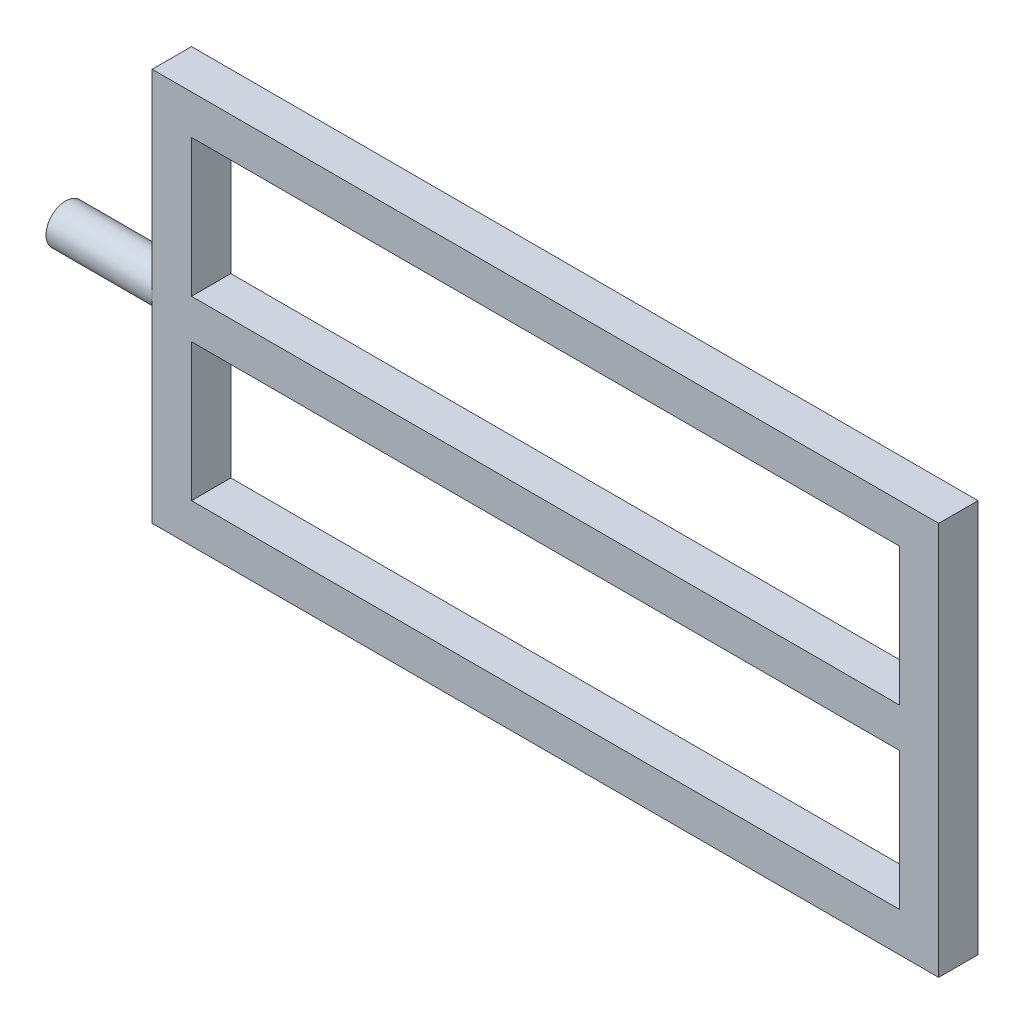
ISO-10303-21;
HEADER;
FILE_DESCRIPTION(('STEP AP214'),'2;1');
FILE_NAME('part.step','',(''),(''),'','','');
FILE_SCHEMA(('AUTOMOTIVE_DESIGN { 1 0 10303 214 1 1 1 1 }'));
ENDSEC;
DATA;
#1=APPLICATION_CONTEXT('core data for automotive mechanical design processes');
#2=APPLICATION_PROTOCOL_DEFINITION('international standard','automotive_design',2000,#1);
#3=PRODUCT_CONTEXT('',#1,'mechanical');
#4=PRODUCT('Part','Part','',(#3));
#5=PRODUCT_RELATED_PRODUCT_CATEGORY('part','',(#4));
#6=PRODUCT_DEFINITION_FORMATION('','',#4);
#7=PRODUCT_DEFINITION_CONTEXT('part definition',#1,'design');
#8=PRODUCT_DEFINITION('design','',#6,#7);
#9=PRODUCT_DEFINITION_SHAPE('','',#8);
#10=(LENGTH_UNIT() NAMED_UNIT(*) SI_UNIT(.MILLI.,.METRE.));
#11=(NAMED_UNIT(*) PLANE_ANGLE_UNIT() SI_UNIT($,.RADIAN.));
#12=(NAMED_UNIT(*) SI_UNIT($,.STERADIAN.) SOLID_ANGLE_UNIT());
#13=UNCERTAINTY_MEASURE_WITH_UNIT(LENGTH_MEASURE(1.E-05),#10,'distance_accuracy_value','');
#14=(GEOMETRIC_REPRESENTATION_CONTEXT(3) GLOBAL_UNCERTAINTY_ASSIGNED_CONTEXT((#13)) GLOBAL_UNIT_ASSIGNED_CONTEXT((#10,
#11,#12)) REPRESENTATION_CONTEXT('',''));
#15=CARTESIAN_POINT('',(0.,0.,0.));
#16=DIRECTION('',(0.,0.,1.));
#17=DIRECTION('',(1.,0.,0.));
#18=AXIS2_PLACEMENT_3D('',#15,#16,#17);
#19=CARTESIAN_POINT('',(-508.547008547008,495.726479063157,0.));
#20=DIRECTION('',(-1.,0.,0.));
#21=DIRECTION('',(0.,-1.,0.));
#22=AXIS2_PLACEMENT_3D('',#19,#20,#21);
#23=PLANE('',#22);
#24=CARTESIAN_POINT('',(-508.547008547008,245.726479063157,25.));
#25=DIRECTION('',(-1.,0.,0.));
#26=DIRECTION('',(0.,0.,1.));
#27=AXIS2_PLACEMENT_3D('',#24,#25,#26);
#28=CIRCLE('',#27,25.);
#29=CARTESIAN_POINT('',(-508.547008547008,245.726479063157,50.));
#30=VERTEX_POINT('',#29);
#31=CARTESIAN_POINT('',(-508.547008547008,245.726479063157,0.));
#32=VERTEX_POINT('',#31);
#33=EDGE_CURVE('E47',#30,#32,#28,.T.);
#34=ORIENTED_EDGE('',*,*,#33,.F.);
#35=DIRECTION('',(0.,-1.,0.));
#36=VECTOR('',#35,1.);
#37=CARTESIAN_POINT('',(-508.547008547008,495.726479063157,50.));
#38=LINE('',#37,#36);
#39=CARTESIAN_POINT('',(-508.547008547008,495.726479063157,50.));
#40=VERTEX_POINT('',#39);
#41=EDGE_CURVE('E141',#40,#30,#38,.T.);
#42=ORIENTED_EDGE('',*,*,#41,.F.);
#43=DIRECTION('',(0.,0.,1.));
#44=VECTOR('',#43,1.);
#45=CARTESIAN_POINT('',(-508.547008547008,495.726479063157,0.));
#46=LINE('',#45,#44);
#47=CARTESIAN_POINT('',(-508.547008547008,495.726479063157,0.));
#48=VERTEX_POINT('',#47);
#49=EDGE_CURVE('E208',#48,#40,#46,.T.);
#50=ORIENTED_EDGE('',*,*,#49,.F.);
#51=DIRECTION('',(0.,-1.,0.));
#52=VECTOR('',#51,1.);
#53=CARTESIAN_POINT('',(-508.547008547008,495.726479063157,0.));
#54=LINE('',#53,#52);
#55=EDGE_CURVE('E262',#48,#32,#54,.T.);
#56=ORIENTED_EDGE('',*,*,#55,.T.);
#57=EDGE_LOOP('',(#34,#42,#50,#56));
#58=FACE_BOUND('',#57,.T.);
#59=ADVANCED_FACE('F36',(#58),#23,.T.);
#60=CARTESIAN_POINT('',(-8.54700854700846,245.726479063157,0.));
#61=DIRECTION('',(0.,0.,1.));
#62=DIRECTION('',(1.,0.,0.));
#63=AXIS2_PLACEMENT_3D('',#60,#61,#62);
#64=PLANE('',#63);
#65=DIRECTION('',(0.,1.,0.));
#66=VECTOR('',#65,1.);
#67=CARTESIAN_POINT('',(-458.547008547008,45.7264790631568,0.));
#68=LINE('',#67,#66);
#69=CARTESIAN_POINT('',(-458.547008547008,45.7264790631568,0.));
#70=VERTEX_POINT('',#69);
#71=CARTESIAN_POINT('',(-458.547008547009,220.726479063157,0.));
#72=VERTEX_POINT('',#71);
#73=EDGE_CURVE('E190',#70,#72,#68,.T.);
#74=ORIENTED_EDGE('',*,*,#73,.F.);
#75=DIRECTION('',(-1.,0.,0.));
#76=VECTOR('',#75,1.);
#77=CARTESIAN_POINT('',(441.452991452991,45.726479063157,0.));
#78=LINE('',#77,#76);
#79=CARTESIAN_POINT('',(441.452991452991,45.726479063157,0.));
#80=VERTEX_POINT('',#79);
#81=EDGE_CURVE('E227',#80,#70,#78,.T.);
#82=ORIENTED_EDGE('',*,*,#81,.F.);
#83=DIRECTION('',(0.,-1.,0.));
#84=VECTOR('',#83,1.);
#85=CARTESIAN_POINT('',(441.452991452991,220.726479063157,0.));
#86=LINE('',#85,#84);
#87=CARTESIAN_POINT('',(441.452991452991,220.726479063157,0.));
#88=VERTEX_POINT('',#87);
#89=EDGE_CURVE('E135',#88,#80,#86,.T.);
#90=ORIENTED_EDGE('',*,*,#89,.F.);
#91=DIRECTION('',(1.,0.,0.));
#92=VECTOR('',#91,1.);
#93=CARTESIAN_POINT('',(-458.547008547009,220.726479063157,0.));
#94=LINE('',#93,#92);
#95=EDGE_CURVE('E204',#72,#88,#94,.T.);
#96=ORIENTED_EDGE('',*,*,#95,.F.);
#97=EDGE_LOOP('',(#74,#82,#90,#96));
#98=FACE_BOUND('',#97,.T.);
#99=DIRECTION('',(-1.,0.,0.));
#100=VECTOR('',#99,1.);
#101=CARTESIAN_POINT('',(441.452991452991,270.726479063157,0.));
#102=LINE('',#101,#100);
#103=CARTESIAN_POINT('',(441.452991452991,270.726479063157,0.));
#104=VERTEX_POINT('',#103);
#105=CARTESIAN_POINT('',(-458.547008547009,270.726479063156,0.));
#106=VERTEX_POINT('',#105);
#107=EDGE_CURVE('E159',#104,#106,#102,.T.);
#108=ORIENTED_EDGE('',*,*,#107,.F.);
#109=DIRECTION('',(0.,-1.,0.));
#110=VECTOR('',#109,1.);
#111=CARTESIAN_POINT('',(441.452991452991,445.726479063157,0.));
#112=LINE('',#111,#110);
#113=CARTESIAN_POINT('',(441.452991452991,445.726479063157,0.));
#114=VERTEX_POINT('',#113);
#115=EDGE_CURVE('E174',#114,#104,#112,.T.);
#116=ORIENTED_EDGE('',*,*,#115,.F.);
#117=DIRECTION('',(1.,0.,0.));
#118=VECTOR('',#117,1.);
#119=CARTESIAN_POINT('',(-458.547008547009,445.726479063156,0.));
#120=LINE('',#119,#118);
#121=CARTESIAN_POINT('',(-458.547008547009,445.726479063156,0.));
#122=VERTEX_POINT('',#121);
#123=EDGE_CURVE('E198',#122,#114,#120,.T.);
#124=ORIENTED_EDGE('',*,*,#123,.F.);
#125=DIRECTION('',(0.,1.,0.));
#126=VECTOR('',#125,1.);
#127=CARTESIAN_POINT('',(-458.547008547009,270.726479063156,0.));
#128=LINE('',#127,#126);
#129=EDGE_CURVE('E224',#106,#122,#128,.T.);
#130=ORIENTED_EDGE('',*,*,#129,.F.);
#131=EDGE_LOOP('',(#108,#116,#124,#130));
#132=FACE_BOUND('',#131,.T.);
#133=DIRECTION('',(1.,0.,0.));
#134=VECTOR('',#133,1.);
#135=CARTESIAN_POINT('',(-508.547008547008,-4.27352093684319,0.));
#136=LINE('',#135,#134);
#137=CARTESIAN_POINT('',(-508.547008547008,-4.27352093684319,0.));
#138=VERTEX_POINT('',#137);
#139=CARTESIAN_POINT('',(491.452991452992,-4.27352093684308,0.));
#140=VERTEX_POINT('',#139);
#141=EDGE_CURVE('E232',#138,#140,#136,.T.);
#142=ORIENTED_EDGE('',*,*,#141,.F.);
#143=EDGE_CURVE('E99',#32,#138,#54,.T.);
#144=ORIENTED_EDGE('',*,*,#143,.F.);
#145=ORIENTED_EDGE('',*,*,#55,.F.);
#146=DIRECTION('',(-1.,0.,0.));
#147=VECTOR('',#146,1.);
#148=CARTESIAN_POINT('',(491.452991452992,495.726479063157,0.));
#149=LINE('',#148,#147);
#150=CARTESIAN_POINT('',(491.452991452992,495.726479063157,0.));
#151=VERTEX_POINT('',#150);
#152=EDGE_CURVE('E107',#151,#48,#149,.T.);
#153=ORIENTED_EDGE('',*,*,#152,.F.);
#154=DIRECTION('',(0.,1.,0.));
#155=VECTOR('',#154,1.);
#156=CARTESIAN_POINT('',(491.452991452992,-4.27352093684308,0.));
#157=LINE('',#156,#155);
#158=EDGE_CURVE('E182',#140,#151,#157,.T.);
#159=ORIENTED_EDGE('',*,*,#158,.F.);
#160=EDGE_LOOP('',(#142,#144,#145,#153,#159));
#161=FACE_BOUND('',#160,.T.);
#162=ADVANCED_FACE('F284',(#98,#132,#161),#64,.F.);
#163=CARTESIAN_POINT('',(-8.54700854700846,245.726479063157,50.));
#164=DIRECTION('',(0.,0.,1.));
#165=DIRECTION('',(1.,0.,0.));
#166=AXIS2_PLACEMENT_3D('',#163,#164,#165);
#167=PLANE('',#166);
#168=DIRECTION('',(0.,1.,0.));
#169=VECTOR('',#168,1.);
#170=CARTESIAN_POINT('',(-458.547008547008,45.7264790631568,50.));
#171=LINE('',#170,#169);
#172=CARTESIAN_POINT('',(-458.547008547008,45.7264790631568,50.));
#173=VERTEX_POINT('',#172);
#174=CARTESIAN_POINT('',(-458.547008547009,220.726479063157,50.));
#175=VERTEX_POINT('',#174);
#176=EDGE_CURVE('E177',#173,#175,#171,.T.);
#177=ORIENTED_EDGE('',*,*,#176,.T.);
#178=DIRECTION('',(1.,0.,0.));
#179=VECTOR('',#178,1.);
#180=CARTESIAN_POINT('',(-458.547008547009,220.726479063157,50.));
#181=LINE('',#180,#179);
#182=CARTESIAN_POINT('',(441.452991452991,220.726479063157,50.));
#183=VERTEX_POINT('',#182);
#184=EDGE_CURVE('E191',#175,#183,#181,.T.);
#185=ORIENTED_EDGE('',*,*,#184,.T.);
#186=DIRECTION('',(0.,-1.,0.));
#187=VECTOR('',#186,1.);
#188=CARTESIAN_POINT('',(441.452991452991,220.726479063157,50.));
#189=LINE('',#188,#187);
#190=CARTESIAN_POINT('',(441.452991452991,45.7264790631569,50.));
#191=VERTEX_POINT('',#190);
#192=EDGE_CURVE('E241',#183,#191,#189,.T.);
#193=ORIENTED_EDGE('',*,*,#192,.T.);
#194=DIRECTION('',(-1.,0.,0.));
#195=VECTOR('',#194,1.);
#196=CARTESIAN_POINT('',(441.452991452991,45.7264790631569,50.));
#197=LINE('',#196,#195);
#198=EDGE_CURVE('E211',#191,#173,#197,.T.);
#199=ORIENTED_EDGE('',*,*,#198,.T.);
#200=EDGE_LOOP('',(#177,#185,#193,#199));
#201=FACE_BOUND('',#200,.T.);
#202=DIRECTION('',(-1.,0.,0.));
#203=VECTOR('',#202,1.);
#204=CARTESIAN_POINT('',(441.452991452991,270.726479063157,50.));
#205=LINE('',#204,#203);
#206=CARTESIAN_POINT('',(441.452991452991,270.726479063157,50.));
#207=VERTEX_POINT('',#206);
#208=CARTESIAN_POINT('',(-458.547008547009,270.726479063156,50.));
#209=VERTEX_POINT('',#208);
#210=EDGE_CURVE('E148',#207,#209,#205,.T.);
#211=ORIENTED_EDGE('',*,*,#210,.T.);
#212=DIRECTION('',(0.,1.,0.));
#213=VECTOR('',#212,1.);
#214=CARTESIAN_POINT('',(-458.547008547009,270.726479063156,50.));
#215=LINE('',#214,#213);
#216=CARTESIAN_POINT('',(-458.547008547009,445.726479063156,50.));
#217=VERTEX_POINT('',#216);
#218=EDGE_CURVE('E203',#209,#217,#215,.T.);
#219=ORIENTED_EDGE('',*,*,#218,.T.);
#220=DIRECTION('',(1.,0.,0.));
#221=VECTOR('',#220,1.);
#222=CARTESIAN_POINT('',(-458.547008547009,445.726479063156,50.));
#223=LINE('',#222,#221);
#224=CARTESIAN_POINT('',(441.452991452991,445.726479063156,50.));
#225=VERTEX_POINT('',#224);
#226=EDGE_CURVE('E165',#217,#225,#223,.T.);
#227=ORIENTED_EDGE('',*,*,#226,.T.);
#228=DIRECTION('',(0.,-1.,0.));
#229=VECTOR('',#228,1.);
#230=CARTESIAN_POINT('',(441.452991452991,445.726479063156,50.));
#231=LINE('',#230,#229);
#232=EDGE_CURVE('E162',#225,#207,#231,.T.);
#233=ORIENTED_EDGE('',*,*,#232,.T.);
#234=EDGE_LOOP('',(#211,#219,#227,#233));
#235=FACE_BOUND('',#234,.T.);
#236=DIRECTION('',(1.,0.,0.));
#237=VECTOR('',#236,1.);
#238=CARTESIAN_POINT('',(-508.547008547008,-4.2735209368433,50.));
#239=LINE('',#238,#237);
#240=CARTESIAN_POINT('',(-508.547008547008,-4.2735209368433,50.));
#241=VERTEX_POINT('',#240);
#242=CARTESIAN_POINT('',(491.452991452992,-4.27352093684308,50.));
#243=VERTEX_POINT('',#242);
#244=EDGE_CURVE('E45',#241,#243,#239,.T.);
#245=ORIENTED_EDGE('',*,*,#244,.T.);
#246=DIRECTION('',(0.,1.,0.));
#247=VECTOR('',#246,1.);
#248=CARTESIAN_POINT('',(491.452991452992,-4.27352093684308,50.));
#249=LINE('',#248,#247);
#250=CARTESIAN_POINT('',(491.452991452992,495.726479063157,50.));
#251=VERTEX_POINT('',#250);
#252=EDGE_CURVE('E185',#243,#251,#249,.T.);
#253=ORIENTED_EDGE('',*,*,#252,.T.);
#254=DIRECTION('',(-1.,0.,0.));
#255=VECTOR('',#254,1.);
#256=CARTESIAN_POINT('',(491.452991452992,495.726479063157,50.));
#257=LINE('',#256,#255);
#258=EDGE_CURVE('E197',#251,#40,#257,.T.);
#259=ORIENTED_EDGE('',*,*,#258,.T.);
#260=ORIENTED_EDGE('',*,*,#41,.T.);
#261=EDGE_CURVE('E240',#30,#241,#38,.T.);
#262=ORIENTED_EDGE('',*,*,#261,.T.);
#263=EDGE_LOOP('',(#245,#253,#259,#260,#262));
#264=FACE_BOUND('',#263,.T.);
#265=ADVANCED_FACE('F163',(#201,#235,#264),#167,.T.);
#266=CARTESIAN_POINT('',(-508.547008547008,-4.27352093684319,0.));
#267=DIRECTION('',(0.,-1.,0.));
#268=DIRECTION('',(1.,0.,0.));
#269=AXIS2_PLACEMENT_3D('',#266,#267,#268);
#270=PLANE('',#269);
#271=ORIENTED_EDGE('',*,*,#141,.T.);
#272=DIRECTION('',(0.,0.,1.));
#273=VECTOR('',#272,1.);
#274=CARTESIAN_POINT('',(491.452991452992,-4.27352093684308,0.));
#275=LINE('',#274,#273);
#276=EDGE_CURVE('E181',#140,#243,#275,.T.);
#277=ORIENTED_EDGE('',*,*,#276,.T.);
#278=ORIENTED_EDGE('',*,*,#244,.F.);
#279=DIRECTION('',(0.,0.,1.));
#280=VECTOR('',#279,1.);
#281=CARTESIAN_POINT('',(-508.547008547008,-4.27352093684319,0.));
#282=LINE('',#281,#280);
#283=EDGE_CURVE('E40',#138,#241,#282,.T.);
#284=ORIENTED_EDGE('',*,*,#283,.F.);
#285=EDGE_LOOP('',(#271,#277,#278,#284));
#286=FACE_BOUND('',#285,.T.);
#287=ADVANCED_FACE('F308',(#286),#270,.T.);
#288=CARTESIAN_POINT('',(491.452991452992,-4.27352093684308,0.));
#289=DIRECTION('',(1.,0.,0.));
#290=DIRECTION('',(0.,1.,0.));
#291=AXIS2_PLACEMENT_3D('',#288,#289,#290);
#292=PLANE('',#291);
#293=ORIENTED_EDGE('',*,*,#158,.T.);
#294=DIRECTION('',(0.,0.,1.));
#295=VECTOR('',#294,1.);
#296=CARTESIAN_POINT('',(491.452991452992,495.726479063157,0.));
#297=LINE('',#296,#295);
#298=EDGE_CURVE('E186',#151,#251,#297,.T.);
#299=ORIENTED_EDGE('',*,*,#298,.T.);
#300=ORIENTED_EDGE('',*,*,#252,.F.);
#301=ORIENTED_EDGE('',*,*,#276,.F.);
#302=EDGE_LOOP('',(#293,#299,#300,#301));
#303=FACE_BOUND('',#302,.T.);
#304=ADVANCED_FACE('F320',(#303),#292,.T.);
#305=CARTESIAN_POINT('',(491.452991452992,495.726479063157,0.));
#306=DIRECTION('',(0.,1.,0.));
#307=DIRECTION('',(-1.,0.,0.));
#308=AXIS2_PLACEMENT_3D('',#305,#306,#307);
#309=PLANE('',#308);
#310=ORIENTED_EDGE('',*,*,#152,.T.);
#311=ORIENTED_EDGE('',*,*,#49,.T.);
#312=ORIENTED_EDGE('',*,*,#258,.F.);
#313=ORIENTED_EDGE('',*,*,#298,.F.);
#314=EDGE_LOOP('',(#310,#311,#312,#313));
#315=FACE_BOUND('',#314,.T.);
#316=ADVANCED_FACE('F332',(#315),#309,.T.);
#317=EDGE_CURVE('E11',#32,#30,#28,.T.);
#318=ORIENTED_EDGE('',*,*,#317,.F.);
#319=ORIENTED_EDGE('',*,*,#143,.T.);
#320=ORIENTED_EDGE('',*,*,#283,.T.);
#321=ORIENTED_EDGE('',*,*,#261,.F.);
#322=EDGE_LOOP('',(#318,#319,#320,#321));
#323=FACE_BOUND('',#322,.T.);
#324=ADVANCED_FACE('F286',(#323),#23,.T.);
#325=CARTESIAN_POINT('',(441.452991452991,270.726479063157,0.));
#326=DIRECTION('',(0.,1.,0.));
#327=DIRECTION('',(-1.,0.,0.));
#328=AXIS2_PLACEMENT_3D('',#325,#326,#327);
#329=PLANE('',#328);
#330=ORIENTED_EDGE('',*,*,#107,.T.);
#331=DIRECTION('',(0.,0.,1.));
#332=VECTOR('',#331,1.);
#333=CARTESIAN_POINT('',(-458.547008547009,270.726479063156,0.));
#334=LINE('',#333,#332);
#335=EDGE_CURVE('E155',#106,#209,#334,.T.);
#336=ORIENTED_EDGE('',*,*,#335,.T.);
#337=ORIENTED_EDGE('',*,*,#210,.F.);
#338=DIRECTION('',(0.,0.,1.));
#339=VECTOR('',#338,1.);
#340=CARTESIAN_POINT('',(441.452991452991,270.726479063157,0.));
#341=LINE('',#340,#339);
#342=EDGE_CURVE('E152',#104,#207,#341,.T.);
#343=ORIENTED_EDGE('',*,*,#342,.F.);
#344=EDGE_LOOP('',(#330,#336,#337,#343));
#345=FACE_BOUND('',#344,.T.);
#346=ADVANCED_FACE('F150',(#345),#329,.T.);
#347=CARTESIAN_POINT('',(-458.547008547009,270.726479063156,0.));
#348=DIRECTION('',(1.,0.,0.));
#349=DIRECTION('',(0.,1.,0.));
#350=AXIS2_PLACEMENT_3D('',#347,#348,#349);
#351=PLANE('',#350);
#352=ORIENTED_EDGE('',*,*,#129,.T.);
#353=DIRECTION('',(0.,0.,1.));
#354=VECTOR('',#353,1.);
#355=CARTESIAN_POINT('',(-458.547008547009,445.726479063156,0.));
#356=LINE('',#355,#354);
#357=EDGE_CURVE('E237',#122,#217,#356,.T.);
#358=ORIENTED_EDGE('',*,*,#357,.T.);
#359=ORIENTED_EDGE('',*,*,#218,.F.);
#360=ORIENTED_EDGE('',*,*,#335,.F.);
#361=EDGE_LOOP('',(#352,#358,#359,#360));
#362=FACE_BOUND('',#361,.T.);
#363=ADVANCED_FACE('F360',(#362),#351,.T.);
#364=CARTESIAN_POINT('',(-458.547008547009,445.726479063156,0.));
#365=DIRECTION('',(0.,-1.,0.));
#366=DIRECTION('',(1.,0.,0.));
#367=AXIS2_PLACEMENT_3D('',#364,#365,#366);
#368=PLANE('',#367);
#369=ORIENTED_EDGE('',*,*,#123,.T.);
#370=DIRECTION('',(0.,0.,1.));
#371=VECTOR('',#370,1.);
#372=CARTESIAN_POINT('',(441.452991452991,445.726479063157,0.));
#373=LINE('',#372,#371);
#374=EDGE_CURVE('E170',#114,#225,#373,.T.);
#375=ORIENTED_EDGE('',*,*,#374,.T.);
#376=ORIENTED_EDGE('',*,*,#226,.F.);
#377=ORIENTED_EDGE('',*,*,#357,.F.);
#378=EDGE_LOOP('',(#369,#375,#376,#377));
#379=FACE_BOUND('',#378,.T.);
#380=ADVANCED_FACE('F368',(#379),#368,.T.);
#381=CARTESIAN_POINT('',(441.452991452991,445.726479063157,0.));
#382=DIRECTION('',(-1.,0.,0.));
#383=DIRECTION('',(0.,-1.,0.));
#384=AXIS2_PLACEMENT_3D('',#381,#382,#383);
#385=PLANE('',#384);
#386=ORIENTED_EDGE('',*,*,#115,.T.);
#387=ORIENTED_EDGE('',*,*,#342,.T.);
#388=ORIENTED_EDGE('',*,*,#232,.F.);
#389=ORIENTED_EDGE('',*,*,#374,.F.);
#390=EDGE_LOOP('',(#386,#387,#388,#389));
#391=FACE_BOUND('',#390,.T.);
#392=ADVANCED_FACE('F172',(#391),#385,.T.);
#393=CARTESIAN_POINT('',(-458.547008547008,45.7264790631568,0.));
#394=DIRECTION('',(1.,0.,0.));
#395=DIRECTION('',(0.,1.,0.));
#396=AXIS2_PLACEMENT_3D('',#393,#394,#395);
#397=PLANE('',#396);
#398=ORIENTED_EDGE('',*,*,#73,.T.);
#399=DIRECTION('',(0.,0.,1.));
#400=VECTOR('',#399,1.);
#401=CARTESIAN_POINT('',(-458.547008547009,220.726479063157,0.));
#402=LINE('',#401,#400);
#403=EDGE_CURVE('E187',#72,#175,#402,.T.);
#404=ORIENTED_EDGE('',*,*,#403,.T.);
#405=ORIENTED_EDGE('',*,*,#176,.F.);
#406=DIRECTION('',(0.,0.,1.));
#407=VECTOR('',#406,1.);
#408=CARTESIAN_POINT('',(-458.547008547008,45.7264790631568,0.));
#409=LINE('',#408,#407);
#410=EDGE_CURVE('E216',#70,#173,#409,.T.);
#411=ORIENTED_EDGE('',*,*,#410,.F.);
#412=EDGE_LOOP('',(#398,#404,#405,#411));
#413=FACE_BOUND('',#412,.T.);
#414=ADVANCED_FACE('F388',(#413),#397,.T.);
#415=CARTESIAN_POINT('',(-458.547008547009,220.726479063157,0.));
#416=DIRECTION('',(0.,-1.,0.));
#417=DIRECTION('',(1.,0.,0.));
#418=AXIS2_PLACEMENT_3D('',#415,#416,#417);
#419=PLANE('',#418);
#420=ORIENTED_EDGE('',*,*,#95,.T.);
#421=DIRECTION('',(0.,0.,1.));
#422=VECTOR('',#421,1.);
#423=CARTESIAN_POINT('',(441.452991452991,220.726479063157,0.));
#424=LINE('',#423,#422);
#425=EDGE_CURVE('E207',#88,#183,#424,.T.);
#426=ORIENTED_EDGE('',*,*,#425,.T.);
#427=ORIENTED_EDGE('',*,*,#184,.F.);
#428=ORIENTED_EDGE('',*,*,#403,.F.);
#429=EDGE_LOOP('',(#420,#426,#427,#428));
#430=FACE_BOUND('',#429,.T.);
#431=ADVANCED_FACE('F398',(#430),#419,.T.);
#432=CARTESIAN_POINT('',(441.452991452991,220.726479063157,0.));
#433=DIRECTION('',(-1.,0.,0.));
#434=DIRECTION('',(0.,-1.,0.));
#435=AXIS2_PLACEMENT_3D('',#432,#433,#434);
#436=PLANE('',#435);
#437=ORIENTED_EDGE('',*,*,#89,.T.);
#438=DIRECTION('',(0.,0.,1.));
#439=VECTOR('',#438,1.);
#440=CARTESIAN_POINT('',(441.452991452991,45.726479063157,0.));
#441=LINE('',#440,#439);
#442=EDGE_CURVE('E215',#80,#191,#441,.T.);
#443=ORIENTED_EDGE('',*,*,#442,.T.);
#444=ORIENTED_EDGE('',*,*,#192,.F.);
#445=ORIENTED_EDGE('',*,*,#425,.F.);
#446=EDGE_LOOP('',(#437,#443,#444,#445));
#447=FACE_BOUND('',#446,.T.);
#448=ADVANCED_FACE('F38',(#447),#436,.T.);
#449=CARTESIAN_POINT('',(441.452991452991,45.726479063157,0.));
#450=DIRECTION('',(0.,1.,0.));
#451=DIRECTION('',(-1.,0.,0.));
#452=AXIS2_PLACEMENT_3D('',#449,#450,#451);
#453=PLANE('',#452);
#454=ORIENTED_EDGE('',*,*,#81,.T.);
#455=ORIENTED_EDGE('',*,*,#410,.T.);
#456=ORIENTED_EDGE('',*,*,#198,.F.);
#457=ORIENTED_EDGE('',*,*,#442,.F.);
#458=EDGE_LOOP('',(#454,#455,#456,#457));
#459=FACE_BOUND('',#458,.T.);
#460=ADVANCED_FACE('F417',(#459),#453,.T.);
#461=CARTESIAN_POINT('',(-643.547008547008,245.726479063157,25.));
#462=DIRECTION('',(1.,0.,0.));
#463=DIRECTION('',(0.,0.,-1.));
#464=AXIS2_PLACEMENT_3D('',#461,#462,#463);
#465=CYLINDRICAL_SURFACE('',#464,25.);
#466=CARTESIAN_POINT('',(-643.547008547008,245.726479063157,25.));
#467=DIRECTION('',(-1.,0.,0.));
#468=DIRECTION('',(0.,0.,1.));
#469=AXIS2_PLACEMENT_3D('',#466,#467,#468);
#470=CIRCLE('',#469,25.);
#471=CARTESIAN_POINT('',(-643.547008547008,245.726479063157,50.));
#472=VERTEX_POINT('',#471);
#473=EDGE_CURVE('E231',#472,#472,#470,.T.);
#474=ORIENTED_EDGE('',*,*,#473,.F.);
#475=EDGE_LOOP('',(#474));
#476=FACE_BOUND('',#475,.T.);
#477=ORIENTED_EDGE('',*,*,#33,.T.);
#478=ORIENTED_EDGE('',*,*,#317,.T.);
#479=EDGE_LOOP('',(#477,#478));
#480=FACE_BOUND('',#479,.T.);
#481=ADVANCED_FACE('F424',(#476,#480),#465,.T.);
#482=CARTESIAN_POINT('',(-643.547008547008,0.,0.));
#483=DIRECTION('',(-1.,0.,0.));
#484=DIRECTION('',(0.,0.,1.));
#485=AXIS2_PLACEMENT_3D('',#482,#483,#484);
#486=PLANE('',#485);
#487=ORIENTED_EDGE('',*,*,#473,.T.);
#488=EDGE_LOOP('',(#487));
#489=FACE_BOUND('',#488,.T.);
#490=ADVANCED_FACE('F434',(#489),#486,.T.);
#491=CLOSED_SHELL('',(#59,#162,#265,#287,#304,#316,#324,#346,#363,#380,#392,#414,#431,#448,#460,
#481,#490));
#492=MANIFOLD_SOLID_BREP('B2',#491);
#493=ADVANCED_BREP_SHAPE_REPRESENTATION('',(#18,#492),#14);
#494=SHAPE_DEFINITION_REPRESENTATION(#9,#493);
ENDSEC;
END-ISO-10303-21;
